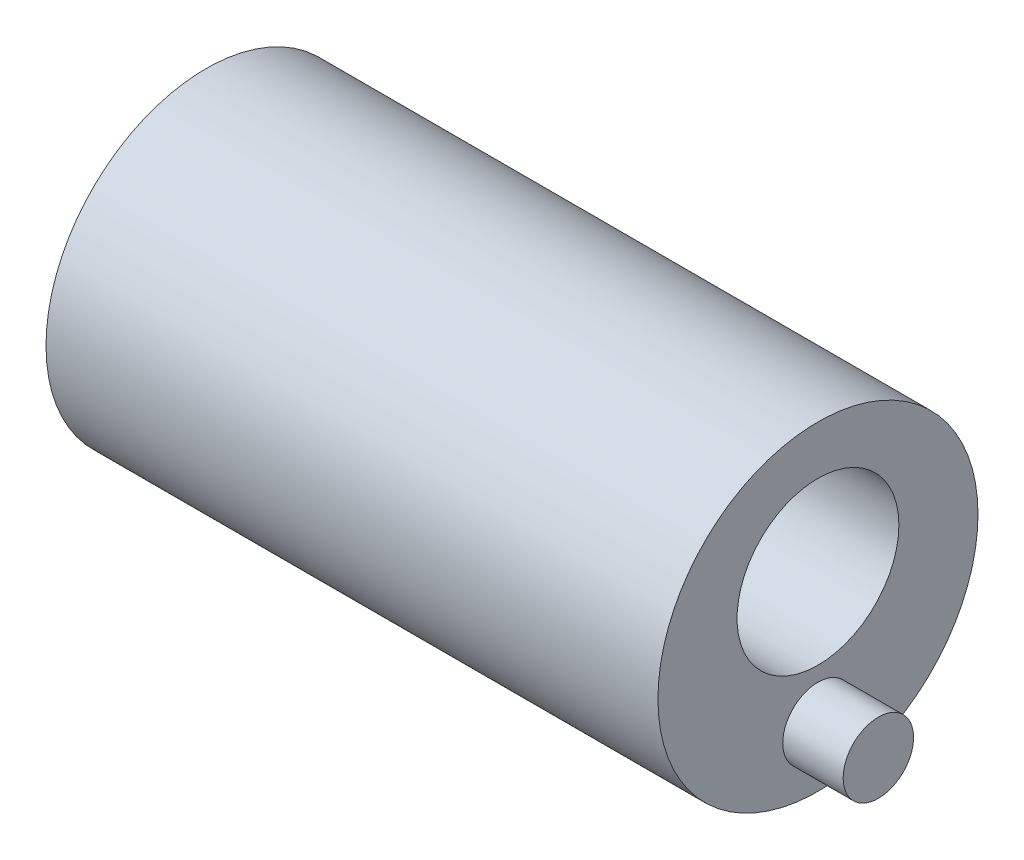
ISO-10303-21;
HEADER;
FILE_DESCRIPTION(('STEP AP214'),'2;1');
FILE_NAME('part.step','',(''),(''),'','','');
FILE_SCHEMA(('AUTOMOTIVE_DESIGN { 1 0 10303 214 1 1 1 1 }'));
ENDSEC;
DATA;
#1=APPLICATION_CONTEXT('core data for automotive mechanical design processes');
#2=APPLICATION_PROTOCOL_DEFINITION('international standard','automotive_design',2000,#1);
#3=PRODUCT_CONTEXT('',#1,'mechanical');
#4=PRODUCT('Part','Part','',(#3));
#5=PRODUCT_RELATED_PRODUCT_CATEGORY('part','',(#4));
#6=PRODUCT_DEFINITION_FORMATION('','',#4);
#7=PRODUCT_DEFINITION_CONTEXT('part definition',#1,'design');
#8=PRODUCT_DEFINITION('design','',#6,#7);
#9=PRODUCT_DEFINITION_SHAPE('','',#8);
#10=(LENGTH_UNIT() NAMED_UNIT(*) SI_UNIT(.MILLI.,.METRE.));
#11=(NAMED_UNIT(*) PLANE_ANGLE_UNIT() SI_UNIT($,.RADIAN.));
#12=(NAMED_UNIT(*) SI_UNIT($,.STERADIAN.) SOLID_ANGLE_UNIT());
#13=UNCERTAINTY_MEASURE_WITH_UNIT(LENGTH_MEASURE(1.E-05),#10,'distance_accuracy_value','');
#14=(GEOMETRIC_REPRESENTATION_CONTEXT(3) GLOBAL_UNCERTAINTY_ASSIGNED_CONTEXT((#13)) GLOBAL_UNIT_ASSIGNED_CONTEXT((#10,
#11,#12)) REPRESENTATION_CONTEXT('',''));
#15=CARTESIAN_POINT('',(0.,0.,0.));
#16=DIRECTION('',(0.,0.,1.));
#17=DIRECTION('',(1.,0.,0.));
#18=AXIS2_PLACEMENT_3D('',#15,#16,#17);
#19=CARTESIAN_POINT('',(-386.08,0.,0.));
#20=DIRECTION('',(1.,0.,0.));
#21=DIRECTION('',(0.,0.,-1.));
#22=AXIS2_PLACEMENT_3D('',#19,#20,#21);
#23=CYLINDRICAL_SURFACE('',#22,100.965);
#24=CARTESIAN_POINT('',(-386.08,0.,0.));
#25=DIRECTION('',(1.,0.,0.));
#26=DIRECTION('',(0.,0.,-1.));
#27=AXIS2_PLACEMENT_3D('',#24,#25,#26);
#28=CIRCLE('',#27,100.965);
#29=CARTESIAN_POINT('',(-386.08,0.,-100.965));
#30=VERTEX_POINT('',#29);
#31=EDGE_CURVE('E10',#30,#30,#28,.T.);
#32=CARTESIAN_POINT('',(0.,0.,0.));
#33=DIRECTION('',(1.,0.,0.));
#34=DIRECTION('',(0.,0.,-1.));
#35=AXIS2_PLACEMENT_3D('',#32,#33,#34);
#36=CIRCLE('',#35,100.965);
#37=CARTESIAN_POINT('',(0.,0.,-100.965));
#38=VERTEX_POINT('',#37);
#39=EDGE_CURVE('E36',#38,#38,#36,.T.);
#40=CARTESIAN_POINT('',(-386.08,0.,-100.965));
#41=CARTESIAN_POINT('',(-382.058333333333,0.,-100.965));
#42=CARTESIAN_POINT('',(-378.036666666667,0.,-100.965));
#43=CARTESIAN_POINT('',(-369.993333333333,0.,-100.965));
#44=CARTESIAN_POINT('',(-365.971666666667,0.,-100.965));
#45=CARTESIAN_POINT('',(-357.928333333333,0.,-100.965));
#46=CARTESIAN_POINT('',(-353.906666666667,0.,-100.965));
#47=CARTESIAN_POINT('',(-345.863333333333,0.,-100.965));
#48=CARTESIAN_POINT('',(-341.841666666667,0.,-100.965));
#49=CARTESIAN_POINT('',(-333.798333333333,0.,-100.965));
#50=CARTESIAN_POINT('',(-329.776666666667,0.,-100.965));
#51=CARTESIAN_POINT('',(-321.733333333333,0.,-100.965));
#52=CARTESIAN_POINT('',(-317.711666666667,0.,-100.965));
#53=CARTESIAN_POINT('',(-309.668333333333,0.,-100.965));
#54=CARTESIAN_POINT('',(-305.646666666667,0.,-100.965));
#55=CARTESIAN_POINT('',(-297.603333333333,0.,-100.965));
#56=CARTESIAN_POINT('',(-293.581666666667,0.,-100.965));
#57=CARTESIAN_POINT('',(-285.538333333333,0.,-100.965));
#58=CARTESIAN_POINT('',(-281.516666666667,0.,-100.965));
#59=CARTESIAN_POINT('',(-273.473333333333,0.,-100.965));
#60=CARTESIAN_POINT('',(-269.451666666667,0.,-100.965));
#61=CARTESIAN_POINT('',(-261.408333333333,0.,-100.965));
#62=CARTESIAN_POINT('',(-257.386666666667,0.,-100.965));
#63=CARTESIAN_POINT('',(-249.343333333333,0.,-100.965));
#64=CARTESIAN_POINT('',(-245.321666666667,0.,-100.965));
#65=CARTESIAN_POINT('',(-237.278333333333,0.,-100.965));
#66=CARTESIAN_POINT('',(-233.256666666667,0.,-100.965));
#67=CARTESIAN_POINT('',(-225.213333333333,0.,-100.965));
#68=CARTESIAN_POINT('',(-221.191666666667,0.,-100.965));
#69=CARTESIAN_POINT('',(-213.148333333333,0.,-100.965));
#70=CARTESIAN_POINT('',(-209.126666666667,0.,-100.965));
#71=CARTESIAN_POINT('',(-201.083333333333,0.,-100.965));
#72=CARTESIAN_POINT('',(-197.061666666667,0.,-100.965));
#73=CARTESIAN_POINT('',(-189.018333333333,0.,-100.965));
#74=CARTESIAN_POINT('',(-184.996666666667,0.,-100.965));
#75=CARTESIAN_POINT('',(-176.953333333333,0.,-100.965));
#76=CARTESIAN_POINT('',(-172.931666666667,0.,-100.965));
#77=CARTESIAN_POINT('',(-164.888333333333,0.,-100.965));
#78=CARTESIAN_POINT('',(-160.866666666667,0.,-100.965));
#79=CARTESIAN_POINT('',(-152.823333333333,0.,-100.965));
#80=CARTESIAN_POINT('',(-148.801666666667,0.,-100.965));
#81=CARTESIAN_POINT('',(-140.758333333333,0.,-100.965));
#82=CARTESIAN_POINT('',(-136.736666666667,0.,-100.965));
#83=CARTESIAN_POINT('',(-128.693333333333,0.,-100.965));
#84=CARTESIAN_POINT('',(-124.671666666667,0.,-100.965));
#85=CARTESIAN_POINT('',(-116.628333333333,0.,-100.965));
#86=CARTESIAN_POINT('',(-112.606666666667,0.,-100.965));
#87=CARTESIAN_POINT('',(-104.563333333333,0.,-100.965));
#88=CARTESIAN_POINT('',(-100.541666666667,0.,-100.965));
#89=CARTESIAN_POINT('',(-92.4983333333334,0.,-100.965));
#90=CARTESIAN_POINT('',(-88.4766666666667,0.,-100.965));
#91=CARTESIAN_POINT('',(-80.4333333333334,0.,-100.965));
#92=CARTESIAN_POINT('',(-76.4116666666667,0.,-100.965));
#93=CARTESIAN_POINT('',(-68.3683333333334,0.,-100.965));
#94=CARTESIAN_POINT('',(-64.3466666666667,0.,-100.965));
#95=CARTESIAN_POINT('',(-56.3033333333334,0.,-100.965));
#96=CARTESIAN_POINT('',(-52.2816666666667,0.,-100.965));
#97=CARTESIAN_POINT('',(-44.2383333333334,0.,-100.965));
#98=CARTESIAN_POINT('',(-40.2166666666667,0.,-100.965));
#99=CARTESIAN_POINT('',(-32.1733333333334,0.,-100.965));
#100=CARTESIAN_POINT('',(-28.1516666666667,0.,-100.965));
#101=CARTESIAN_POINT('',(-20.1083333333334,0.,-100.965));
#102=CARTESIAN_POINT('',(-16.0866666666667,0.,-100.965));
#103=CARTESIAN_POINT('',(-8.04333333333338,0.,-100.965));
#104=CARTESIAN_POINT('',(-4.02166666666672,0.,-100.965));
#105=CARTESIAN_POINT('',(0.,0.,-100.965));
#106=B_SPLINE_CURVE_WITH_KNOTS('',3,(#40,#41,#42,#43,#44,#45,#46,#47,#48,#49,#50,#51,#52,#53,
#54,#55,#56,#57,#58,#59,#60,#61,#62,#63,#64,#65,#66,#67,#68,#69,#70,#71,#72,#73,#74,#75,#76,#77,
#78,#79,#80,#81,#82,#83,#84,#85,#86,#87,#88,#89,#90,#91,#92,#93,#94,#95,#96,#97,#98,#99,#100,
#101,#102,#103,#104,#105),.UNSPECIFIED.,.F.,.F.,(4,2,2,2,2,2,2,2,2,2,2,2,2,2,2,2,2,2,2,2,2,2,2,
2,2,2,2,2,2,2,2,2,4),(0.,12.065,24.13,36.195,48.26,60.325,72.39,84.4549999999999,
96.5199999999999,108.585,120.65,132.715,144.78,156.845,168.91,180.975,193.04,205.105,217.17,
229.235,241.3,253.365,265.43,277.495,289.56,301.625,313.69,325.755,337.82,349.885,361.95,
374.015,386.08),.UNSPECIFIED.);
#107=EDGE_CURVE('BSEAM33',#30,#38,#106,.T.);
#108=ORIENTED_EDGE('',*,*,#31,.T.);
#109=ORIENTED_EDGE('',*,*,#39,.F.);
#110=ORIENTED_EDGE('',*,*,#107,.T.);
#111=ORIENTED_EDGE('',*,*,#107,.F.);
#112=EDGE_LOOP('',(#108,#110,#109,#111));
#113=FACE_BOUND('',#112,.T.);
#114=ADVANCED_FACE('F33',(#113),#23,.T.);
#115=CARTESIAN_POINT('',(-386.08,0.,0.));
#116=DIRECTION('',(1.,0.,0.));
#117=DIRECTION('',(0.,0.,-1.));
#118=AXIS2_PLACEMENT_3D('',#115,#116,#117);
#119=PLANE('',#118);
#120=CARTESIAN_POINT('',(-386.08,19.0499999999965,0.));
#121=DIRECTION('',(1.,0.,0.));
#122=DIRECTION('',(0.,0.,-1.));
#123=AXIS2_PLACEMENT_3D('',#120,#121,#122);
#124=CIRCLE('',#123,51.054);
#125=CARTESIAN_POINT('',(-386.08,19.0499999999965,-51.054));
#126=VERTEX_POINT('',#125);
#127=EDGE_CURVE('E43',#126,#126,#124,.T.);
#128=ORIENTED_EDGE('',*,*,#127,.T.);
#129=EDGE_LOOP('',(#128));
#130=FACE_BOUND('',#129,.T.);
#131=ORIENTED_EDGE('',*,*,#31,.F.);
#132=EDGE_LOOP('',(#131));
#133=FACE_BOUND('',#132,.T.);
#134=ADVANCED_FACE('F69',(#130,#133),#119,.F.);
#135=CARTESIAN_POINT('',(0.,0.,0.));
#136=DIRECTION('',(1.,0.,0.));
#137=DIRECTION('',(0.,0.,-1.));
#138=AXIS2_PLACEMENT_3D('',#135,#136,#137);
#139=PLANE('',#138);
#140=CARTESIAN_POINT('',(0.,-63.5000000000024,-1.1085453250827E-13));
#141=DIRECTION('',(1.,0.,0.));
#142=DIRECTION('',(0.,0.,-1.));
#143=AXIS2_PLACEMENT_3D('',#140,#141,#142);
#144=CIRCLE('',#143,22.225);
#145=CARTESIAN_POINT('',(0.,-63.5000000000024,22.2249999999999));
#146=VERTEX_POINT('',#145);
#147=EDGE_CURVE('E51',#146,#146,#144,.T.);
#148=ORIENTED_EDGE('',*,*,#147,.F.);
#149=EDGE_LOOP('',(#148));
#150=FACE_BOUND('',#149,.T.);
#151=CARTESIAN_POINT('',(0.,19.0499999999965,0.));
#152=DIRECTION('',(1.,0.,0.));
#153=DIRECTION('',(0.,0.,-1.));
#154=AXIS2_PLACEMENT_3D('',#151,#152,#153);
#155=CIRCLE('',#154,51.054);
#156=CARTESIAN_POINT('',(0.,19.0499999999965,-51.054));
#157=VERTEX_POINT('',#156);
#158=EDGE_CURVE('E45',#157,#157,#155,.T.);
#159=ORIENTED_EDGE('',*,*,#158,.F.);
#160=EDGE_LOOP('',(#159));
#161=FACE_BOUND('',#160,.T.);
#162=ORIENTED_EDGE('',*,*,#39,.T.);
#163=EDGE_LOOP('',(#162));
#164=FACE_BOUND('',#163,.T.);
#165=ADVANCED_FACE('F66',(#150,#161,#164),#139,.T.);
#166=CARTESIAN_POINT('',(-386.08,19.0499999999965,0.));
#167=DIRECTION('',(1.,0.,0.));
#168=DIRECTION('',(0.,0.,-1.));
#169=AXIS2_PLACEMENT_3D('',#166,#167,#168);
#170=CYLINDRICAL_SURFACE('',#169,51.054);
#171=CARTESIAN_POINT('',(-386.08,19.0499999999965,-51.054));
#172=CARTESIAN_POINT('',(-382.058333333333,19.0499999999965,-51.054));
#173=CARTESIAN_POINT('',(-378.036666666667,19.0499999999965,-51.054));
#174=CARTESIAN_POINT('',(-369.993333333333,19.0499999999965,-51.054));
#175=CARTESIAN_POINT('',(-365.971666666667,19.0499999999965,-51.054));
#176=CARTESIAN_POINT('',(-357.928333333333,19.0499999999965,-51.054));
#177=CARTESIAN_POINT('',(-353.906666666667,19.0499999999965,-51.054));
#178=CARTESIAN_POINT('',(-345.863333333333,19.0499999999965,-51.054));
#179=CARTESIAN_POINT('',(-341.841666666667,19.0499999999965,-51.054));
#180=CARTESIAN_POINT('',(-333.798333333333,19.0499999999965,-51.054));
#181=CARTESIAN_POINT('',(-329.776666666667,19.0499999999965,-51.054));
#182=CARTESIAN_POINT('',(-321.733333333333,19.0499999999965,-51.054));
#183=CARTESIAN_POINT('',(-317.711666666667,19.0499999999965,-51.054));
#184=CARTESIAN_POINT('',(-309.668333333333,19.0499999999965,-51.054));
#185=CARTESIAN_POINT('',(-305.646666666667,19.0499999999965,-51.054));
#186=CARTESIAN_POINT('',(-297.603333333333,19.0499999999965,-51.054));
#187=CARTESIAN_POINT('',(-293.581666666667,19.0499999999965,-51.054));
#188=CARTESIAN_POINT('',(-285.538333333333,19.0499999999965,-51.054));
#189=CARTESIAN_POINT('',(-281.516666666667,19.0499999999965,-51.054));
#190=CARTESIAN_POINT('',(-273.473333333333,19.0499999999965,-51.054));
#191=CARTESIAN_POINT('',(-269.451666666667,19.0499999999965,-51.054));
#192=CARTESIAN_POINT('',(-261.408333333333,19.0499999999965,-51.054));
#193=CARTESIAN_POINT('',(-257.386666666667,19.0499999999965,-51.054));
#194=CARTESIAN_POINT('',(-249.343333333333,19.0499999999965,-51.054));
#195=CARTESIAN_POINT('',(-245.321666666667,19.0499999999965,-51.054));
#196=CARTESIAN_POINT('',(-237.278333333333,19.0499999999965,-51.054));
#197=CARTESIAN_POINT('',(-233.256666666667,19.0499999999965,-51.054));
#198=CARTESIAN_POINT('',(-225.213333333333,19.0499999999965,-51.054));
#199=CARTESIAN_POINT('',(-221.191666666667,19.0499999999965,-51.054));
#200=CARTESIAN_POINT('',(-213.148333333333,19.0499999999965,-51.054));
#201=CARTESIAN_POINT('',(-209.126666666667,19.0499999999965,-51.054));
#202=CARTESIAN_POINT('',(-201.083333333333,19.0499999999965,-51.054));
#203=CARTESIAN_POINT('',(-197.061666666667,19.0499999999965,-51.054));
#204=CARTESIAN_POINT('',(-189.018333333333,19.0499999999965,-51.054));
#205=CARTESIAN_POINT('',(-184.996666666667,19.0499999999965,-51.054));
#206=CARTESIAN_POINT('',(-176.953333333333,19.0499999999965,-51.054));
#207=CARTESIAN_POINT('',(-172.931666666667,19.0499999999965,-51.054));
#208=CARTESIAN_POINT('',(-164.888333333333,19.0499999999965,-51.054));
#209=CARTESIAN_POINT('',(-160.866666666667,19.0499999999965,-51.054));
#210=CARTESIAN_POINT('',(-152.823333333333,19.0499999999965,-51.054));
#211=CARTESIAN_POINT('',(-148.801666666667,19.0499999999965,-51.054));
#212=CARTESIAN_POINT('',(-140.758333333333,19.0499999999965,-51.054));
#213=CARTESIAN_POINT('',(-136.736666666667,19.0499999999965,-51.054));
#214=CARTESIAN_POINT('',(-128.693333333333,19.0499999999965,-51.054));
#215=CARTESIAN_POINT('',(-124.671666666667,19.0499999999965,-51.054));
#216=CARTESIAN_POINT('',(-116.628333333333,19.0499999999965,-51.054));
#217=CARTESIAN_POINT('',(-112.606666666667,19.0499999999965,-51.054));
#218=CARTESIAN_POINT('',(-104.563333333333,19.0499999999965,-51.054));
#219=CARTESIAN_POINT('',(-100.541666666667,19.0499999999965,-51.054));
#220=CARTESIAN_POINT('',(-92.4983333333334,19.0499999999965,-51.054));
#221=CARTESIAN_POINT('',(-88.4766666666667,19.0499999999965,-51.054));
#222=CARTESIAN_POINT('',(-80.4333333333334,19.0499999999965,-51.054));
#223=CARTESIAN_POINT('',(-76.4116666666667,19.0499999999965,-51.054));
#224=CARTESIAN_POINT('',(-68.3683333333334,19.0499999999965,-51.054));
#225=CARTESIAN_POINT('',(-64.3466666666667,19.0499999999965,-51.054));
#226=CARTESIAN_POINT('',(-56.3033333333334,19.0499999999965,-51.054));
#227=CARTESIAN_POINT('',(-52.2816666666667,19.0499999999965,-51.054));
#228=CARTESIAN_POINT('',(-44.2383333333334,19.0499999999965,-51.054));
#229=CARTESIAN_POINT('',(-40.2166666666667,19.0499999999965,-51.054));
#230=CARTESIAN_POINT('',(-32.1733333333334,19.0499999999965,-51.054));
#231=CARTESIAN_POINT('',(-28.1516666666667,19.0499999999965,-51.054));
#232=CARTESIAN_POINT('',(-20.1083333333334,19.0499999999965,-51.054));
#233=CARTESIAN_POINT('',(-16.0866666666667,19.0499999999965,-51.054));
#234=CARTESIAN_POINT('',(-8.04333333333338,19.0499999999965,-51.054));
#235=CARTESIAN_POINT('',(-4.02166666666672,19.0499999999965,-51.054));
#236=CARTESIAN_POINT('',(0.,19.0499999999965,-51.054));
#237=B_SPLINE_CURVE_WITH_KNOTS('',3,(#171,#172,#173,#174,#175,#176,#177,#178,#179,#180,#181,
#182,#183,#184,#185,#186,#187,#188,#189,#190,#191,#192,#193,#194,#195,#196,#197,#198,#199,#200,
#201,#202,#203,#204,#205,#206,#207,#208,#209,#210,#211,#212,#213,#214,#215,#216,#217,#218,#219,
#220,#221,#222,#223,#224,#225,#226,#227,#228,#229,#230,#231,#232,#233,#234,#235,#236),
.UNSPECIFIED.,.F.,.F.,(4,2,2,2,2,2,2,2,2,2,2,2,2,2,2,2,2,2,2,2,2,2,2,2,2,2,2,2,2,2,2,2,4),(0.,
12.065,24.13,36.195,48.26,60.325,72.39,84.4549999999999,96.5199999999999,108.585,120.65,132.715,
144.78,156.845,168.91,180.975,193.04,205.105,217.17,229.235,241.3,253.365,265.43,277.495,289.56,
301.625,313.69,325.755,337.82,349.885,361.95,374.015,386.08),.UNSPECIFIED.);
#238=EDGE_CURVE('BSEAM62',#126,#157,#237,.T.);
#239=ORIENTED_EDGE('',*,*,#127,.F.);
#240=ORIENTED_EDGE('',*,*,#158,.T.);
#241=ORIENTED_EDGE('',*,*,#238,.T.);
#242=ORIENTED_EDGE('',*,*,#238,.F.);
#243=EDGE_LOOP('',(#239,#241,#240,#242));
#244=FACE_BOUND('',#243,.T.);
#245=ADVANCED_FACE('F62',(#244),#170,.F.);
#246=CARTESIAN_POINT('',(38.1,-63.5000000000024,-1.1085453250827E-13));
#247=DIRECTION('',(-1.,0.,0.));
#248=DIRECTION('',(0.,0.,1.));
#249=AXIS2_PLACEMENT_3D('',#246,#247,#248);
#250=CYLINDRICAL_SURFACE('',#249,22.225);
#251=CARTESIAN_POINT('',(38.1,-63.5000000000024,-1.1085453250827E-13));
#252=DIRECTION('',(1.,0.,0.));
#253=DIRECTION('',(0.,0.,-1.));
#254=AXIS2_PLACEMENT_3D('',#251,#252,#253);
#255=CIRCLE('',#254,22.225);
#256=CARTESIAN_POINT('',(38.1,-63.5000000000024,22.2249999999999));
#257=VERTEX_POINT('',#256);
#258=EDGE_CURVE('E48',#257,#257,#255,.T.);
#259=CARTESIAN_POINT('',(38.1,-63.5000000000024,22.2249999999999));
#260=CARTESIAN_POINT('',(37.703125,-63.5000000000024,22.2249999999999));
#261=CARTESIAN_POINT('',(37.30625,-63.5000000000024,22.2249999999999));
#262=CARTESIAN_POINT('',(36.5125,-63.5000000000024,22.2249999999999));
#263=CARTESIAN_POINT('',(36.115625,-63.5000000000024,22.2249999999999));
#264=CARTESIAN_POINT('',(35.321875,-63.5000000000024,22.2249999999999));
#265=CARTESIAN_POINT('',(34.925,-63.5000000000024,22.2249999999999));
#266=CARTESIAN_POINT('',(34.13125,-63.5000000000024,22.2249999999999));
#267=CARTESIAN_POINT('',(33.734375,-63.5000000000024,22.2249999999999));
#268=CARTESIAN_POINT('',(32.940625,-63.5000000000024,22.2249999999999));
#269=CARTESIAN_POINT('',(32.54375,-63.5000000000024,22.2249999999999));
#270=CARTESIAN_POINT('',(31.75,-63.5000000000024,22.2249999999999));
#271=CARTESIAN_POINT('',(31.353125,-63.5000000000024,22.2249999999999));
#272=CARTESIAN_POINT('',(30.559375,-63.5000000000024,22.2249999999999));
#273=CARTESIAN_POINT('',(30.1625,-63.5000000000024,22.2249999999999));
#274=CARTESIAN_POINT('',(29.36875,-63.5000000000024,22.2249999999999));
#275=CARTESIAN_POINT('',(28.971875,-63.5000000000024,22.2249999999999));
#276=CARTESIAN_POINT('',(28.178125,-63.5000000000024,22.2249999999999));
#277=CARTESIAN_POINT('',(27.78125,-63.5000000000024,22.2249999999999));
#278=CARTESIAN_POINT('',(26.9875,-63.5000000000024,22.2249999999999));
#279=CARTESIAN_POINT('',(26.590625,-63.5000000000024,22.2249999999999));
#280=CARTESIAN_POINT('',(25.796875,-63.5000000000024,22.2249999999999));
#281=CARTESIAN_POINT('',(25.4,-63.5000000000024,22.2249999999999));
#282=CARTESIAN_POINT('',(24.60625,-63.5000000000024,22.2249999999999));
#283=CARTESIAN_POINT('',(24.209375,-63.5000000000024,22.2249999999999));
#284=CARTESIAN_POINT('',(23.415625,-63.5000000000024,22.2249999999999));
#285=CARTESIAN_POINT('',(23.01875,-63.5000000000024,22.2249999999999));
#286=CARTESIAN_POINT('',(22.225,-63.5000000000024,22.2249999999999));
#287=CARTESIAN_POINT('',(21.828125,-63.5000000000024,22.2249999999999));
#288=CARTESIAN_POINT('',(21.034375,-63.5000000000024,22.2249999999999));
#289=CARTESIAN_POINT('',(20.6375,-63.5000000000024,22.2249999999999));
#290=CARTESIAN_POINT('',(19.84375,-63.5000000000024,22.2249999999999));
#291=CARTESIAN_POINT('',(19.446875,-63.5000000000024,22.2249999999999));
#292=CARTESIAN_POINT('',(18.653125,-63.5000000000024,22.2249999999999));
#293=CARTESIAN_POINT('',(18.25625,-63.5000000000024,22.2249999999999));
#294=CARTESIAN_POINT('',(17.4625,-63.5000000000024,22.2249999999999));
#295=CARTESIAN_POINT('',(17.065625,-63.5000000000024,22.2249999999999));
#296=CARTESIAN_POINT('',(16.271875,-63.5000000000024,22.2249999999999));
#297=CARTESIAN_POINT('',(15.875,-63.5000000000024,22.2249999999999));
#298=CARTESIAN_POINT('',(15.08125,-63.5000000000024,22.2249999999999));
#299=CARTESIAN_POINT('',(14.684375,-63.5000000000024,22.2249999999999));
#300=CARTESIAN_POINT('',(13.890625,-63.5000000000024,22.2249999999999));
#301=CARTESIAN_POINT('',(13.49375,-63.5000000000024,22.2249999999999));
#302=CARTESIAN_POINT('',(12.7,-63.5000000000024,22.2249999999999));
#303=CARTESIAN_POINT('',(12.303125,-63.5000000000024,22.2249999999999));
#304=CARTESIAN_POINT('',(11.509375,-63.5000000000024,22.2249999999999));
#305=CARTESIAN_POINT('',(11.1125,-63.5000000000024,22.2249999999999));
#306=CARTESIAN_POINT('',(10.31875,-63.5000000000024,22.2249999999999));
#307=CARTESIAN_POINT('',(9.92187499999999,-63.5000000000024,22.2249999999999));
#308=CARTESIAN_POINT('',(9.128125,-63.5000000000024,22.2249999999999));
#309=CARTESIAN_POINT('',(8.73124999999999,-63.5000000000024,22.2249999999999));
#310=CARTESIAN_POINT('',(7.93749999999999,-63.5000000000024,22.2249999999999));
#311=CARTESIAN_POINT('',(7.54062499999999,-63.5000000000024,22.2249999999999));
#312=CARTESIAN_POINT('',(6.746875,-63.5000000000024,22.2249999999999));
#313=CARTESIAN_POINT('',(6.35,-63.5000000000024,22.2249999999999));
#314=CARTESIAN_POINT('',(5.55625,-63.5000000000024,22.2249999999999));
#315=CARTESIAN_POINT('',(5.159375,-63.5000000000024,22.2249999999999));
#316=CARTESIAN_POINT('',(4.365625,-63.5000000000024,22.2249999999999));
#317=CARTESIAN_POINT('',(3.96875,-63.5000000000024,22.2249999999999));
#318=CARTESIAN_POINT('',(3.175,-63.5000000000024,22.2249999999999));
#319=CARTESIAN_POINT('',(2.778125,-63.5000000000024,22.2249999999999));
#320=CARTESIAN_POINT('',(1.984375,-63.5000000000024,22.2249999999999));
#321=CARTESIAN_POINT('',(1.5875,-63.5000000000024,22.2249999999999));
#322=CARTESIAN_POINT('',(0.79375,-63.5000000000024,22.2249999999999));
#323=CARTESIAN_POINT('',(0.396875,-63.5000000000024,22.2249999999999));
#324=CARTESIAN_POINT('',(0.,-63.5000000000024,22.2249999999999));
#325=B_SPLINE_CURVE_WITH_KNOTS('',3,(#259,#260,#261,#262,#263,#264,#265,#266,#267,#268,#269,
#270,#271,#272,#273,#274,#275,#276,#277,#278,#279,#280,#281,#282,#283,#284,#285,#286,#287,#288,
#289,#290,#291,#292,#293,#294,#295,#296,#297,#298,#299,#300,#301,#302,#303,#304,#305,#306,#307,
#308,#309,#310,#311,#312,#313,#314,#315,#316,#317,#318,#319,#320,#321,#322,#323,#324),
.UNSPECIFIED.,.F.,.F.,(4,2,2,2,2,2,2,2,2,2,2,2,2,2,2,2,2,2,2,2,2,2,2,2,2,2,2,2,2,2,2,2,4),(0.,
1.190625,2.38125,3.571875,4.7625,5.953125,7.14375,8.334375,9.52500000000001,10.715625,11.90625,
13.096875,14.2875,15.478125,16.66875,17.859375,19.05,20.240625,21.43125,22.621875,23.8125,
25.003125,26.19375,27.384375,28.575,29.765625,30.95625,32.146875,33.3375,34.528125,35.71875,
36.909375,38.1),.UNSPECIFIED.);
#326=EDGE_CURVE('BSEAM59',#257,#146,#325,.T.);
#327=ORIENTED_EDGE('',*,*,#258,.F.);
#328=ORIENTED_EDGE('',*,*,#147,.T.);
#329=ORIENTED_EDGE('',*,*,#326,.T.);
#330=ORIENTED_EDGE('',*,*,#326,.F.);
#331=EDGE_LOOP('',(#327,#329,#328,#330));
#332=FACE_BOUND('',#331,.T.);
#333=ADVANCED_FACE('F59',(#332),#250,.T.);
#334=CARTESIAN_POINT('',(38.1,-63.5000000000024,-1.1085453250827E-13));
#335=DIRECTION('',(1.,0.,0.));
#336=DIRECTION('',(0.,0.,-1.));
#337=AXIS2_PLACEMENT_3D('',#334,#335,#336);
#338=PLANE('',#337);
#339=ORIENTED_EDGE('',*,*,#258,.T.);
#340=EDGE_LOOP('',(#339));
#341=FACE_BOUND('',#340,.T.);
#342=ADVANCED_FACE('F57',(#341),#338,.T.);
#343=CLOSED_SHELL('',(#114,#134,#165,#245,#333,#342));
#344=MANIFOLD_SOLID_BREP('B2',#343);
#345=ADVANCED_BREP_SHAPE_REPRESENTATION('',(#18,#344),#14);
#346=SHAPE_DEFINITION_REPRESENTATION(#9,#345);
ENDSEC;
END-ISO-10303-21;
